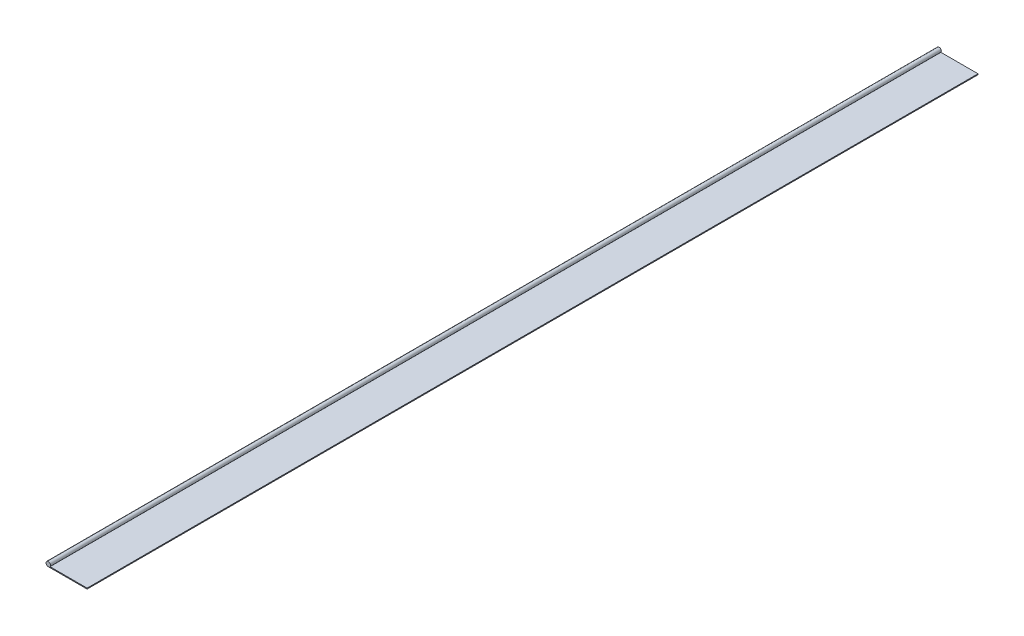
ISO-10303-21;
HEADER;
FILE_DESCRIPTION(('STEP AP214'),'2;1');
FILE_NAME('part.step','',(''),(''),'','','');
FILE_SCHEMA(('AUTOMOTIVE_DESIGN { 1 0 10303 214 1 1 1 1 }'));
ENDSEC;
DATA;
#1=APPLICATION_CONTEXT('core data for automotive mechanical design processes');
#2=APPLICATION_PROTOCOL_DEFINITION('international standard','automotive_design',2000,#1);
#3=PRODUCT_CONTEXT('',#1,'mechanical');
#4=PRODUCT('Part','Part','',(#3));
#5=PRODUCT_RELATED_PRODUCT_CATEGORY('part','',(#4));
#6=PRODUCT_DEFINITION_FORMATION('','',#4);
#7=PRODUCT_DEFINITION_CONTEXT('part definition',#1,'design');
#8=PRODUCT_DEFINITION('design','',#6,#7);
#9=PRODUCT_DEFINITION_SHAPE('','',#8);
#10=(LENGTH_UNIT() NAMED_UNIT(*) SI_UNIT(.MILLI.,.METRE.));
#11=(NAMED_UNIT(*) PLANE_ANGLE_UNIT() SI_UNIT($,.RADIAN.));
#12=(NAMED_UNIT(*) SI_UNIT($,.STERADIAN.) SOLID_ANGLE_UNIT());
#13=UNCERTAINTY_MEASURE_WITH_UNIT(LENGTH_MEASURE(1.E-05),#10,'distance_accuracy_value','');
#14=(GEOMETRIC_REPRESENTATION_CONTEXT(3) GLOBAL_UNCERTAINTY_ASSIGNED_CONTEXT((#13)) GLOBAL_UNIT_ASSIGNED_CONTEXT((#10,
#11,#12)) REPRESENTATION_CONTEXT('',''));
#15=CARTESIAN_POINT('',(0.,0.,0.));
#16=DIRECTION('',(0.,0.,1.));
#17=DIRECTION('',(1.,0.,0.));
#18=AXIS2_PLACEMENT_3D('',#15,#16,#17);
#19=CARTESIAN_POINT('',(0.,-0.900000000000003,600.));
#20=DIRECTION('',(0.,-1.,0.));
#21=DIRECTION('',(1.,0.,0.));
#22=AXIS2_PLACEMENT_3D('',#19,#20,#21);
#23=PLANE('',#22);
#24=DIRECTION('',(-1.,0.,0.));
#25=VECTOR('',#24,1.);
#26=CARTESIAN_POINT('',(0.,-0.900000000000003,0.));
#27=LINE('',#26,#25);
#28=CARTESIAN_POINT('',(26.2,-0.9,0.));
#29=VERTEX_POINT('',#28);
#30=CARTESIAN_POINT('',(1.2,-0.900000000000003,0.));
#31=VERTEX_POINT('',#30);
#32=EDGE_CURVE('E98',#29,#31,#27,.T.);
#33=ORIENTED_EDGE('',*,*,#32,.T.);
#34=DIRECTION('',(0.,0.,-1.));
#35=VECTOR('',#34,1.);
#36=CARTESIAN_POINT('',(1.2,-0.900000000000003,600.));
#37=LINE('',#36,#35);
#38=CARTESIAN_POINT('',(1.2,-0.900000000000003,600.));
#39=VERTEX_POINT('',#38);
#40=EDGE_CURVE('E11',#39,#31,#37,.T.);
#41=ORIENTED_EDGE('',*,*,#40,.F.);
#42=DIRECTION('',(-1.,0.,0.));
#43=VECTOR('',#42,1.);
#44=CARTESIAN_POINT('',(0.,-0.900000000000003,600.));
#45=LINE('',#44,#43);
#46=CARTESIAN_POINT('',(26.2,-0.9,600.));
#47=VERTEX_POINT('',#46);
#48=EDGE_CURVE('E86',#47,#39,#45,.T.);
#49=ORIENTED_EDGE('',*,*,#48,.F.);
#50=DIRECTION('',(0.,0.,-1.));
#51=VECTOR('',#50,1.);
#52=CARTESIAN_POINT('',(26.2,-0.9,600.));
#53=LINE('',#52,#51);
#54=EDGE_CURVE('E94',#47,#29,#53,.T.);
#55=ORIENTED_EDGE('',*,*,#54,.T.);
#56=EDGE_LOOP('',(#33,#41,#49,#55));
#57=FACE_BOUND('',#56,.T.);
#58=ADVANCED_FACE('F35',(#57),#23,.F.);
#59=CARTESIAN_POINT('',(0.,0.,600.));
#60=DIRECTION('',(0.,0.,-1.));
#61=DIRECTION('',(-1.,0.,0.));
#62=AXIS2_PLACEMENT_3D('',#59,#60,#61);
#63=CYLINDRICAL_SURFACE('',#62,1.5);
#64=CARTESIAN_POINT('',(0.,0.,0.));
#65=DIRECTION('',(0.,0.,1.));
#66=DIRECTION('',(1.,0.,0.));
#67=AXIS2_PLACEMENT_3D('',#64,#65,#66);
#68=CIRCLE('',#67,1.5);
#69=CARTESIAN_POINT('',(0.,-1.5,0.));
#70=VERTEX_POINT('',#69);
#71=EDGE_CURVE('E90',#31,#70,#68,.T.);
#72=ORIENTED_EDGE('',*,*,#71,.T.);
#73=DIRECTION('',(0.,0.,-1.));
#74=VECTOR('',#73,1.);
#75=CARTESIAN_POINT('',(0.,-1.5,600.));
#76=LINE('',#75,#74);
#77=CARTESIAN_POINT('',(0.,-1.5,600.));
#78=VERTEX_POINT('',#77);
#79=EDGE_CURVE('E43',#78,#70,#76,.T.);
#80=ORIENTED_EDGE('',*,*,#79,.F.);
#81=CARTESIAN_POINT('',(0.,0.,600.));
#82=DIRECTION('',(0.,0.,1.));
#83=DIRECTION('',(1.,0.,0.));
#84=AXIS2_PLACEMENT_3D('',#81,#82,#83);
#85=CIRCLE('',#84,1.5);
#86=EDGE_CURVE('E81',#39,#78,#85,.T.);
#87=ORIENTED_EDGE('',*,*,#86,.F.);
#88=ORIENTED_EDGE('',*,*,#40,.T.);
#89=EDGE_LOOP('',(#72,#80,#87,#88));
#90=FACE_BOUND('',#89,.T.);
#91=ADVANCED_FACE('F89',(#90),#63,.T.);
#92=CARTESIAN_POINT('',(0.,-1.5,600.));
#93=DIRECTION('',(0.,1.,0.));
#94=DIRECTION('',(0.,0.,1.));
#95=AXIS2_PLACEMENT_3D('',#92,#93,#94);
#96=PLANE('',#95);
#97=DIRECTION('',(1.,0.,0.));
#98=VECTOR('',#97,1.);
#99=CARTESIAN_POINT('',(0.,-1.5,0.));
#100=LINE('',#99,#98);
#101=CARTESIAN_POINT('',(26.2,-1.5,0.));
#102=VERTEX_POINT('',#101);
#103=EDGE_CURVE('E68',#70,#102,#100,.T.);
#104=ORIENTED_EDGE('',*,*,#103,.T.);
#105=DIRECTION('',(0.,0.,-1.));
#106=VECTOR('',#105,1.);
#107=CARTESIAN_POINT('',(26.2,-1.5,600.));
#108=LINE('',#107,#106);
#109=CARTESIAN_POINT('',(26.2,-1.5,600.));
#110=VERTEX_POINT('',#109);
#111=EDGE_CURVE('E91',#110,#102,#108,.T.);
#112=ORIENTED_EDGE('',*,*,#111,.F.);
#113=DIRECTION('',(1.,0.,0.));
#114=VECTOR('',#113,1.);
#115=CARTESIAN_POINT('',(0.,-1.5,600.));
#116=LINE('',#115,#114);
#117=EDGE_CURVE('E84',#78,#110,#116,.T.);
#118=ORIENTED_EDGE('',*,*,#117,.F.);
#119=ORIENTED_EDGE('',*,*,#79,.T.);
#120=EDGE_LOOP('',(#104,#112,#118,#119));
#121=FACE_BOUND('',#120,.T.);
#122=ADVANCED_FACE('F92',(#121),#96,.F.);
#123=CARTESIAN_POINT('',(26.2,0.,600.));
#124=DIRECTION('',(-1.,0.,0.));
#125=DIRECTION('',(0.,0.,1.));
#126=AXIS2_PLACEMENT_3D('',#123,#124,#125);
#127=PLANE('',#126);
#128=DIRECTION('',(0.,1.,0.));
#129=VECTOR('',#128,1.);
#130=CARTESIAN_POINT('',(26.2,0.,0.));
#131=LINE('',#130,#129);
#132=EDGE_CURVE('E74',#102,#29,#131,.T.);
#133=ORIENTED_EDGE('',*,*,#132,.T.);
#134=ORIENTED_EDGE('',*,*,#54,.F.);
#135=DIRECTION('',(0.,1.,0.));
#136=VECTOR('',#135,1.);
#137=CARTESIAN_POINT('',(26.2,0.,600.));
#138=LINE('',#137,#136);
#139=EDGE_CURVE('E51',#110,#47,#138,.T.);
#140=ORIENTED_EDGE('',*,*,#139,.F.);
#141=ORIENTED_EDGE('',*,*,#111,.T.);
#142=EDGE_LOOP('',(#133,#134,#140,#141));
#143=FACE_BOUND('',#142,.T.);
#144=ADVANCED_FACE('F105',(#143),#127,.F.);
#145=CARTESIAN_POINT('',(0.,0.,600.));
#146=DIRECTION('',(0.,0.,1.));
#147=DIRECTION('',(1.,0.,0.));
#148=AXIS2_PLACEMENT_3D('',#145,#146,#147);
#149=PLANE('',#148);
#150=ORIENTED_EDGE('',*,*,#48,.T.);
#151=ORIENTED_EDGE('',*,*,#86,.T.);
#152=ORIENTED_EDGE('',*,*,#117,.T.);
#153=ORIENTED_EDGE('',*,*,#139,.T.);
#154=EDGE_LOOP('',(#150,#151,#152,#153));
#155=FACE_BOUND('',#154,.T.);
#156=ADVANCED_FACE('F82',(#155),#149,.T.);
#157=CARTESIAN_POINT('',(0.,0.,0.));
#158=DIRECTION('',(0.,0.,1.));
#159=DIRECTION('',(1.,0.,0.));
#160=AXIS2_PLACEMENT_3D('',#157,#158,#159);
#161=PLANE('',#160);
#162=ORIENTED_EDGE('',*,*,#32,.F.);
#163=ORIENTED_EDGE('',*,*,#132,.F.);
#164=ORIENTED_EDGE('',*,*,#103,.F.);
#165=ORIENTED_EDGE('',*,*,#71,.F.);
#166=EDGE_LOOP('',(#162,#163,#164,#165));
#167=FACE_BOUND('',#166,.T.);
#168=ADVANCED_FACE('F108',(#167),#161,.F.);
#169=CLOSED_SHELL('',(#58,#91,#122,#144,#156,#168));
#170=MANIFOLD_SOLID_BREP('B2',#169);
#171=ADVANCED_BREP_SHAPE_REPRESENTATION('',(#18,#170),#14);
#172=SHAPE_DEFINITION_REPRESENTATION(#9,#171);
ENDSEC;
END-ISO-10303-21;
